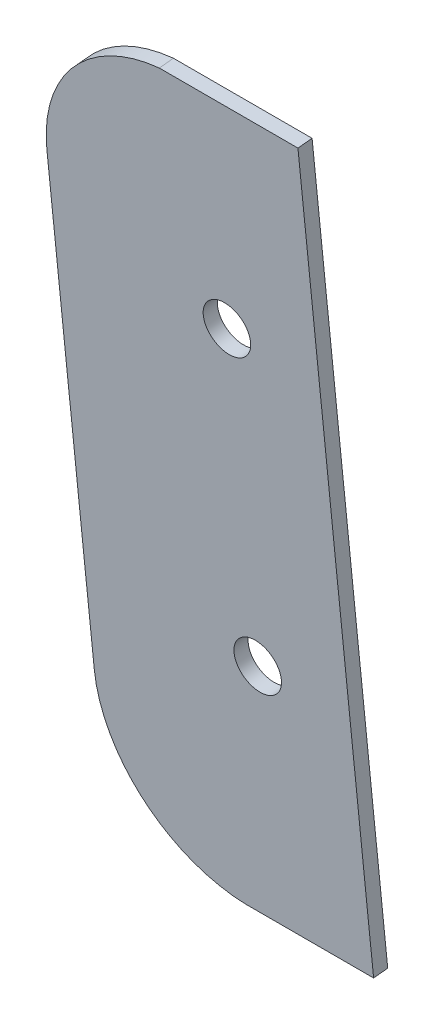
ISO-10303-21;
HEADER;
FILE_DESCRIPTION(('STEP AP214'),'2;1');
FILE_NAME('part.step','',(''),(''),'','','');
FILE_SCHEMA(('AUTOMOTIVE_DESIGN { 1 0 10303 214 1 1 1 1 }'));
ENDSEC;
DATA;
#1=APPLICATION_CONTEXT('core data for automotive mechanical design processes');
#2=APPLICATION_PROTOCOL_DEFINITION('international standard','automotive_design',2000,#1);
#3=PRODUCT_CONTEXT('',#1,'mechanical');
#4=PRODUCT('Part','Part','',(#3));
#5=PRODUCT_RELATED_PRODUCT_CATEGORY('part','',(#4));
#6=PRODUCT_DEFINITION_FORMATION('','',#4);
#7=PRODUCT_DEFINITION_CONTEXT('part definition',#1,'design');
#8=PRODUCT_DEFINITION('design','',#6,#7);
#9=PRODUCT_DEFINITION_SHAPE('','',#8);
#10=(LENGTH_UNIT() NAMED_UNIT(*) SI_UNIT(.MILLI.,.METRE.));
#11=(NAMED_UNIT(*) PLANE_ANGLE_UNIT() SI_UNIT($,.RADIAN.));
#12=(NAMED_UNIT(*) SI_UNIT($,.STERADIAN.) SOLID_ANGLE_UNIT());
#13=UNCERTAINTY_MEASURE_WITH_UNIT(LENGTH_MEASURE(1.E-05),#10,'distance_accuracy_value','');
#14=(GEOMETRIC_REPRESENTATION_CONTEXT(3) GLOBAL_UNCERTAINTY_ASSIGNED_CONTEXT((#13)) GLOBAL_UNIT_ASSIGNED_CONTEXT((#10,
#11,#12)) REPRESENTATION_CONTEXT('',''));
#15=CARTESIAN_POINT('',(0.,0.,0.));
#16=DIRECTION('',(0.,0.,1.));
#17=DIRECTION('',(1.,0.,0.));
#18=AXIS2_PLACEMENT_3D('',#15,#16,#17);
#19=CARTESIAN_POINT('',(-21.5,14.8507444214685,-75.6154243140644));
#20=DIRECTION('',(0.,-0.0995037190209984,0.995037190209989));
#21=DIRECTION('',(0.,-0.995037190209989,-0.0995037190209984));
#22=AXIS2_PLACEMENT_3D('',#19,#20,#21);
#23=ELLIPSE('',#22,15.0748134316813,15.);
#24=DIRECTION('',(0.,0.0995037190209984,-0.995037190209989));
#25=VECTOR('',#24,1.);
#26=SURFACE_OF_LINEAR_EXTRUSION('',#23,#25);
#27=CARTESIAN_POINT('',(-21.5,15.,-77.1079800993794));
#28=DIRECTION('',(0.,-0.0995037190209984,0.995037190209989));
#29=DIRECTION('',(0.,-0.995037190209989,-0.0995037190209984));
#30=AXIS2_PLACEMENT_3D('',#27,#28,#29);
#31=ELLIPSE('',#30,15.0748134316813,15.);
#32=CARTESIAN_POINT('',(-36.5,15.,-77.1079800993794));
#33=VERTEX_POINT('',#32);
#34=CARTESIAN_POINT('',(-22.0566392360362,0.0103317995058666,-78.6069469194288));
#35=VERTEX_POINT('',#34);
#36=EDGE_CURVE('E151',#33,#35,#31,.T.);
#37=ORIENTED_EDGE('',*,*,#36,.T.);
#38=DIRECTION('',(0.,0.0995037190209984,-0.995037190209989));
#39=VECTOR('',#38,1.);
#40=CARTESIAN_POINT('',(-22.0566392360362,-0.138923779025631,-77.1143911341138));
#41=LINE('',#40,#39);
#42=CARTESIAN_POINT('',(-22.0566392360362,-0.138923779025631,-77.1143911341138));
#43=VERTEX_POINT('',#42);
#44=EDGE_CURVE('E11',#43,#35,#41,.T.);
#45=ORIENTED_EDGE('',*,*,#44,.F.);
#46=CARTESIAN_POINT('',(-36.5,14.8507444214685,-75.6154243140644));
#47=VERTEX_POINT('',#46);
#48=EDGE_CURVE('E159',#47,#43,#23,.T.);
#49=ORIENTED_EDGE('',*,*,#48,.F.);
#50=DIRECTION('',(0.,0.0995037190209984,-0.995037190209989));
#51=VECTOR('',#50,1.);
#52=CARTESIAN_POINT('',(-36.5,14.8507444214685,-75.6154243140644));
#53=LINE('',#52,#51);
#54=EDGE_CURVE('E120',#47,#33,#53,.T.);
#55=ORIENTED_EDGE('',*,*,#54,.T.);
#56=EDGE_LOOP('',(#37,#45,#49,#55));
#57=FACE_BOUND('',#56,.T.);
#58=ADVANCED_FACE('F39',(#57),#26,.F.);
#59=CARTESIAN_POINT('',(-22.0566392360362,-0.138923779025631,-77.1143911341138));
#60=DIRECTION('',(0.,0.995037190209989,0.0995037190209984));
#61=DIRECTION('',(0.,-0.0995037190209984,0.995037190209989));
#62=AXIS2_PLACEMENT_3D('',#59,#60,#61);
#63=PLANE('',#62);
#64=DIRECTION('',(1.,0.,0.));
#65=VECTOR('',#64,1.);
#66=CARTESIAN_POINT('',(-22.0566392360362,0.0103317995058666,-78.6069469194288));
#67=LINE('',#66,#65);
#68=CARTESIAN_POINT('',(-8.49999999999997,0.0103317995058727,-78.6069469194288));
#69=VERTEX_POINT('',#68);
#70=EDGE_CURVE('E143',#35,#69,#67,.T.);
#71=ORIENTED_EDGE('',*,*,#70,.T.);
#72=DIRECTION('',(0.,0.0995037190209984,-0.995037190209989));
#73=VECTOR('',#72,1.);
#74=CARTESIAN_POINT('',(-8.49999999999998,-0.138923779025625,-77.1143911341138));
#75=LINE('',#74,#73);
#76=CARTESIAN_POINT('',(-8.49999999999998,-0.138923779025625,-77.1143911341138));
#77=VERTEX_POINT('',#76);
#78=EDGE_CURVE('E48',#77,#69,#75,.T.);
#79=ORIENTED_EDGE('',*,*,#78,.F.);
#80=DIRECTION('',(1.,0.,0.));
#81=VECTOR('',#80,1.);
#82=CARTESIAN_POINT('',(-22.0566392360362,-0.138923779025631,-77.1143911341138));
#83=LINE('',#82,#81);
#84=EDGE_CURVE('E92',#43,#77,#83,.T.);
#85=ORIENTED_EDGE('',*,*,#84,.F.);
#86=ORIENTED_EDGE('',*,*,#44,.T.);
#87=EDGE_LOOP('',(#71,#79,#85,#86));
#88=FACE_BOUND('',#87,.T.);
#89=ADVANCED_FACE('F136',(#88),#63,.F.);
#90=CARTESIAN_POINT('',(-8.49999999999998,-0.138923779025625,-77.1143911341138));
#91=DIRECTION('',(-1.,0.,0.));
#92=DIRECTION('',(0.,0.,1.));
#93=AXIS2_PLACEMENT_3D('',#90,#91,#92);
#94=PLANE('',#93);
#95=DIRECTION('',(0.,0.995037190209989,0.0995037190209984));
#96=VECTOR('',#95,1.);
#97=CARTESIAN_POINT('',(-8.49999999999997,0.0103317995058727,-78.6069469194288));
#98=LINE('',#97,#96);
#99=CARTESIAN_POINT('',(-8.49999999999998,79.9100652252774,-70.6169735768516));
#100=VERTEX_POINT('',#99);
#101=EDGE_CURVE('E150',#69,#100,#98,.T.);
#102=ORIENTED_EDGE('',*,*,#101,.T.);
#103=DIRECTION('',(0.,0.0995037190209984,-0.995037190209989));
#104=VECTOR('',#103,1.);
#105=CARTESIAN_POINT('',(-8.49999999999998,79.7608096467459,-69.1244177915367));
#106=LINE('',#105,#104);
#107=CARTESIAN_POINT('',(-8.49999999999998,79.7608096467459,-69.1244177915367));
#108=VERTEX_POINT('',#107);
#109=EDGE_CURVE('E115',#108,#100,#106,.T.);
#110=ORIENTED_EDGE('',*,*,#109,.F.);
#111=DIRECTION('',(0.,0.995037190209989,0.0995037190209984));
#112=VECTOR('',#111,1.);
#113=CARTESIAN_POINT('',(-8.49999999999998,-0.138923779025625,-77.1143911341138));
#114=LINE('',#113,#112);
#115=EDGE_CURVE('E105',#77,#108,#114,.T.);
#116=ORIENTED_EDGE('',*,*,#115,.F.);
#117=ORIENTED_EDGE('',*,*,#78,.T.);
#118=EDGE_LOOP('',(#102,#110,#116,#117));
#119=FACE_BOUND('',#118,.T.);
#120=ADVANCED_FACE('F134',(#119),#94,.F.);
#121=CARTESIAN_POINT('',(-8.49999999999998,79.7608096467459,-69.1244177915367));
#122=DIRECTION('',(0.,-0.995037190209989,-0.0995037190209984));
#123=DIRECTION('',(0.,0.0995037190209984,-0.995037190209989));
#124=AXIS2_PLACEMENT_3D('',#121,#122,#123);
#125=PLANE('',#124);
#126=DIRECTION('',(-1.,0.,0.));
#127=VECTOR('',#126,1.);
#128=CARTESIAN_POINT('',(-8.49999999999998,79.9100652252774,-70.6169735768516));
#129=LINE('',#128,#127);
#130=CARTESIAN_POINT('',(-23.1401082214218,79.9100652252773,-70.6169735768516));
#131=VERTEX_POINT('',#130);
#132=EDGE_CURVE('E114',#100,#131,#129,.T.);
#133=ORIENTED_EDGE('',*,*,#132,.T.);
#134=DIRECTION('',(0.,0.0995037190209984,-0.995037190209989));
#135=VECTOR('',#134,1.);
#136=CARTESIAN_POINT('',(-23.1401082214218,79.7608096467458,-69.1244177915367));
#137=LINE('',#136,#135);
#138=CARTESIAN_POINT('',(-23.1401082214218,79.7608096467458,-69.1244177915367));
#139=VERTEX_POINT('',#138);
#140=EDGE_CURVE('E111',#139,#131,#137,.T.);
#141=ORIENTED_EDGE('',*,*,#140,.F.);
#142=DIRECTION('',(-1.,0.,0.));
#143=VECTOR('',#142,1.);
#144=CARTESIAN_POINT('',(-8.49999999999998,79.7608096467459,-69.1244177915367));
#145=LINE('',#144,#143);
#146=EDGE_CURVE('E99',#108,#139,#145,.T.);
#147=ORIENTED_EDGE('',*,*,#146,.F.);
#148=ORIENTED_EDGE('',*,*,#109,.T.);
#149=EDGE_LOOP('',(#133,#141,#147,#148));
#150=FACE_BOUND('',#149,.T.);
#151=ADVANCED_FACE('F112',(#150),#125,.F.);
#152=CARTESIAN_POINT('',(-21.5,64.8507444214685,-70.6154243140644));
#153=DIRECTION('',(0.,-0.0995037190209984,0.995037190209989));
#154=DIRECTION('',(0.,0.995037190209989,0.0995037190209984));
#155=AXIS2_PLACEMENT_3D('',#152,#153,#154);
#156=ELLIPSE('',#155,15.0748134316813,15.);
#157=DIRECTION('',(0.,0.0995037190209984,-0.995037190209989));
#158=VECTOR('',#157,1.);
#159=SURFACE_OF_LINEAR_EXTRUSION('',#156,#158);
#160=CARTESIAN_POINT('',(-21.5,65.,-72.1079800993794));
#161=DIRECTION('',(0.,-0.0995037190209984,0.995037190209989));
#162=DIRECTION('',(0.,0.995037190209989,0.0995037190209984));
#163=AXIS2_PLACEMENT_3D('',#160,#161,#162);
#164=ELLIPSE('',#163,15.0748134316813,15.);
#165=CARTESIAN_POINT('',(-36.5,65.,-72.1079800993794));
#166=VERTEX_POINT('',#165);
#167=EDGE_CURVE('E78',#131,#166,#164,.T.);
#168=ORIENTED_EDGE('',*,*,#167,.T.);
#169=DIRECTION('',(0.,0.0995037190209984,-0.995037190209989));
#170=VECTOR('',#169,1.);
#171=CARTESIAN_POINT('',(-36.5,64.8507444214685,-70.6154243140644));
#172=LINE('',#171,#170);
#173=CARTESIAN_POINT('',(-36.5,64.8507444214685,-70.6154243140644));
#174=VERTEX_POINT('',#173);
#175=EDGE_CURVE('E116',#174,#166,#172,.T.);
#176=ORIENTED_EDGE('',*,*,#175,.F.);
#177=CARTESIAN_POINT('',(-21.5,64.8507444214685,-70.6154243140644));
#178=DIRECTION('',(0.,-0.0995037190209984,0.995037190209989));
#179=DIRECTION('',(0.,-0.995037190209989,-0.0995037190209984));
#180=AXIS2_PLACEMENT_3D('',#177,#178,#179);
#181=ELLIPSE('',#180,15.0748134316813,15.);
#182=EDGE_CURVE('E103',#139,#174,#181,.T.);
#183=ORIENTED_EDGE('',*,*,#182,.F.);
#184=ORIENTED_EDGE('',*,*,#140,.T.);
#185=EDGE_LOOP('',(#168,#176,#183,#184));
#186=FACE_BOUND('',#185,.T.);
#187=ADVANCED_FACE('F118',(#186),#159,.F.);
#188=CARTESIAN_POINT('',(-36.5,64.8507444214685,-70.6154243140644));
#189=DIRECTION('',(1.,0.,0.));
#190=DIRECTION('',(0.,0.,-1.));
#191=AXIS2_PLACEMENT_3D('',#188,#189,#190);
#192=PLANE('',#191);
#193=DIRECTION('',(0.,-0.995037190209989,-0.0995037190209985));
#194=VECTOR('',#193,1.);
#195=CARTESIAN_POINT('',(-36.5,65.,-72.1079800993794));
#196=LINE('',#195,#194);
#197=EDGE_CURVE('E84',#166,#33,#196,.T.);
#198=ORIENTED_EDGE('',*,*,#197,.T.);
#199=ORIENTED_EDGE('',*,*,#54,.F.);
#200=DIRECTION('',(0.,-0.995037190209989,-0.0995037190209985));
#201=VECTOR('',#200,1.);
#202=CARTESIAN_POINT('',(-36.5,64.8507444214685,-70.6154243140644));
#203=LINE('',#202,#201);
#204=EDGE_CURVE('E56',#174,#47,#203,.T.);
#205=ORIENTED_EDGE('',*,*,#204,.F.);
#206=ORIENTED_EDGE('',*,*,#175,.T.);
#207=EDGE_LOOP('',(#198,#199,#205,#206));
#208=FACE_BOUND('',#207,.T.);
#209=ADVANCED_FACE('F130',(#208),#192,.F.);
#210=CARTESIAN_POINT('',(-21.5,14.8507444214685,-75.6154243140644));
#211=DIRECTION('',(0.,-0.0995037190209984,0.995037190209989));
#212=DIRECTION('',(0.,-0.995037190209989,-0.0995037190209984));
#213=AXIS2_PLACEMENT_3D('',#210,#211,#212);
#214=PLANE('',#213);
#215=CARTESIAN_POINT('',(-18.2499999999973,24.7426236392288,-74.6262363922883));
#216=DIRECTION('',(0.,0.0995037190209984,-0.995037190209989));
#217=DIRECTION('',(0.,0.995037190209989,0.0995037190209984));
#218=AXIS2_PLACEMENT_3D('',#215,#216,#217);
#219=ELLIPSE('',#218,2.51246890536857,2.50000000008791);
#220=CARTESIAN_POINT('',(-18.2499999999973,27.2426236393167,-74.3762363922796));
#221=VERTEX_POINT('',#220);
#222=EDGE_CURVE('E162',#221,#221,#219,.F.);
#223=ORIENTED_EDGE('',*,*,#222,.F.);
#224=EDGE_LOOP('',(#223));
#225=FACE_BOUND('',#224,.T.);
#226=CARTESIAN_POINT('',(-18.2499999999973,57.2426236392288,-71.3762363922884));
#227=DIRECTION('',(0.,0.0995037190209984,-0.995037190209989));
#228=DIRECTION('',(0.,0.995037190209989,0.0995037190209984));
#229=AXIS2_PLACEMENT_3D('',#226,#227,#228);
#230=ELLIPSE('',#229,2.51246890533739,2.50000000005688);
#231=CARTESIAN_POINT('',(-18.2499999999973,59.7426236392857,-71.1262363922827));
#232=VERTEX_POINT('',#231);
#233=EDGE_CURVE('E164',#232,#232,#230,.F.);
#234=ORIENTED_EDGE('',*,*,#233,.F.);
#235=EDGE_LOOP('',(#234));
#236=FACE_BOUND('',#235,.T.);
#237=ORIENTED_EDGE('',*,*,#48,.T.);
#238=ORIENTED_EDGE('',*,*,#84,.T.);
#239=ORIENTED_EDGE('',*,*,#115,.T.);
#240=ORIENTED_EDGE('',*,*,#146,.T.);
#241=ORIENTED_EDGE('',*,*,#182,.T.);
#242=ORIENTED_EDGE('',*,*,#204,.T.);
#243=EDGE_LOOP('',(#237,#238,#239,#240,#241,#242));
#244=FACE_BOUND('',#243,.T.);
#245=ADVANCED_FACE('F101',(#225,#236,#244),#214,.T.);
#246=CARTESIAN_POINT('',(-21.5,15.,-77.1079800993794));
#247=DIRECTION('',(0.,-0.0995037190209984,0.995037190209989));
#248=DIRECTION('',(0.,-0.995037190209989,-0.0995037190209984));
#249=AXIS2_PLACEMENT_3D('',#246,#247,#248);
#250=PLANE('',#249);
#251=CARTESIAN_POINT('',(-18.2499999999973,24.8918792177603,-76.1187921776033));
#252=DIRECTION('',(0.,0.0995037190209984,-0.995037190209989));
#253=DIRECTION('',(0.,0.995037190209989,0.0995037190209984));
#254=AXIS2_PLACEMENT_3D('',#251,#252,#253);
#255=ELLIPSE('',#254,2.51246890536857,2.50000000008791);
#256=CARTESIAN_POINT('',(-18.2499999999973,27.3918792178482,-75.8687921775945));
#257=VERTEX_POINT('',#256);
#258=EDGE_CURVE('E169',#257,#257,#255,.T.);
#259=ORIENTED_EDGE('',*,*,#258,.F.);
#260=EDGE_LOOP('',(#259));
#261=FACE_BOUND('',#260,.T.);
#262=CARTESIAN_POINT('',(-18.2499999999973,57.3918792177603,-72.8687921776033));
#263=DIRECTION('',(0.,0.0995037190209984,-0.995037190209989));
#264=DIRECTION('',(0.,0.995037190209989,0.0995037190209984));
#265=AXIS2_PLACEMENT_3D('',#262,#263,#264);
#266=ELLIPSE('',#265,2.51246890533739,2.50000000005688);
#267=CARTESIAN_POINT('',(-18.2499999999973,59.8918792178172,-72.6187921775976));
#268=VERTEX_POINT('',#267);
#269=EDGE_CURVE('E177',#268,#268,#266,.T.);
#270=ORIENTED_EDGE('',*,*,#269,.F.);
#271=EDGE_LOOP('',(#270));
#272=FACE_BOUND('',#271,.T.);
#273=ORIENTED_EDGE('',*,*,#36,.F.);
#274=ORIENTED_EDGE('',*,*,#197,.F.);
#275=ORIENTED_EDGE('',*,*,#167,.F.);
#276=ORIENTED_EDGE('',*,*,#132,.F.);
#277=ORIENTED_EDGE('',*,*,#101,.F.);
#278=ORIENTED_EDGE('',*,*,#70,.F.);
#279=EDGE_LOOP('',(#273,#274,#275,#276,#277,#278));
#280=FACE_BOUND('',#279,.T.);
#281=ADVANCED_FACE('F153',(#261,#272,#280),#250,.F.);
#282=CARTESIAN_POINT('',(-18.2499999999973,56.4515371696667,-63.4653716966674));
#283=DIRECTION('',(0.,0.0995037190209984,-0.995037190209989));
#284=DIRECTION('',(0.,0.995037190209989,0.0995037190209984));
#285=AXIS2_PLACEMENT_3D('',#282,#283,#284);
#286=ELLIPSE('',#285,2.51246890533739,2.50000000005688);
#287=DIRECTION('',(0.,0.0995037190209984,-0.995037190209989));
#288=VECTOR('',#287,1.);
#289=SURFACE_OF_LINEAR_EXTRUSION('',#286,#288);
#290=ORIENTED_EDGE('',*,*,#233,.T.);
#291=EDGE_LOOP('',(#290));
#292=FACE_BOUND('',#291,.T.);
#293=ORIENTED_EDGE('',*,*,#269,.T.);
#294=EDGE_LOOP('',(#293));
#295=FACE_BOUND('',#294,.T.);
#296=ADVANCED_FACE('F180',(#292,#295),#289,.F.);
#297=CARTESIAN_POINT('',(-18.2499999999973,23.9515371696667,-66.7153716966674));
#298=DIRECTION('',(0.,0.0995037190209984,-0.995037190209989));
#299=DIRECTION('',(0.,0.995037190209989,0.0995037190209984));
#300=AXIS2_PLACEMENT_3D('',#297,#298,#299);
#301=ELLIPSE('',#300,2.51246890536857,2.50000000008791);
#302=DIRECTION('',(0.,0.0995037190209984,-0.995037190209989));
#303=VECTOR('',#302,1.);
#304=SURFACE_OF_LINEAR_EXTRUSION('',#301,#303);
#305=ORIENTED_EDGE('',*,*,#222,.T.);
#306=EDGE_LOOP('',(#305));
#307=FACE_BOUND('',#306,.T.);
#308=ORIENTED_EDGE('',*,*,#258,.T.);
#309=EDGE_LOOP('',(#308));
#310=FACE_BOUND('',#309,.T.);
#311=ADVANCED_FACE('F184',(#307,#310),#304,.F.);
#312=CLOSED_SHELL('',(#58,#89,#120,#151,#187,#209,#245,#281,#296,#311));
#313=MANIFOLD_SOLID_BREP('B2',#312);
#314=ADVANCED_BREP_SHAPE_REPRESENTATION('',(#18,#313),#14);
#315=SHAPE_DEFINITION_REPRESENTATION(#9,#314);
ENDSEC;
END-ISO-10303-21;
